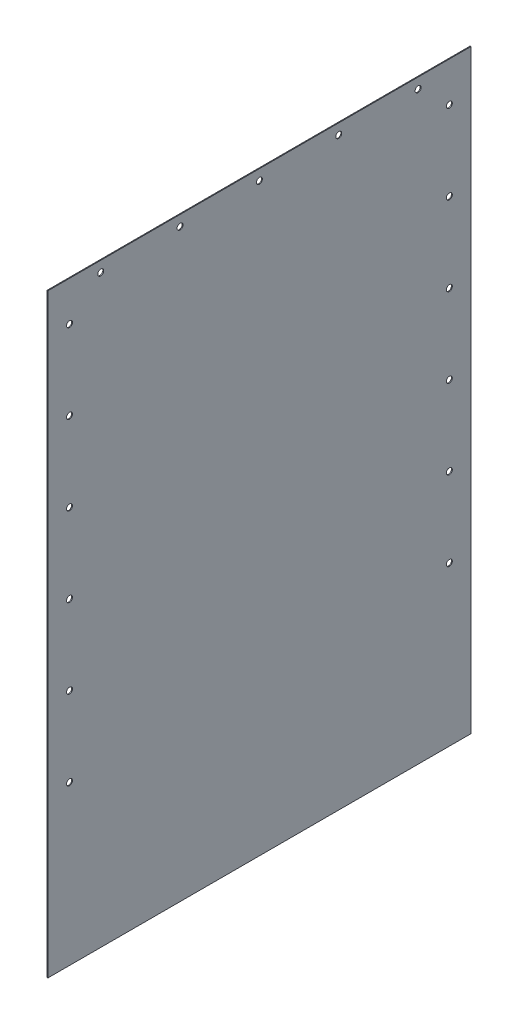
ISO-10303-21;
HEADER;
FILE_DESCRIPTION(('STEP AP214'),'2;1');
FILE_NAME('part.step','',(''),(''),'','','');
FILE_SCHEMA(('AUTOMOTIVE_DESIGN { 1 0 10303 214 1 1 1 1 }'));
ENDSEC;
DATA;
#1=APPLICATION_CONTEXT('core data for automotive mechanical design processes');
#2=APPLICATION_PROTOCOL_DEFINITION('international standard','automotive_design',2000,#1);
#3=PRODUCT_CONTEXT('',#1,'mechanical');
#4=PRODUCT('Part','Part','',(#3));
#5=PRODUCT_RELATED_PRODUCT_CATEGORY('part','',(#4));
#6=PRODUCT_DEFINITION_FORMATION('','',#4);
#7=PRODUCT_DEFINITION_CONTEXT('part definition',#1,'design');
#8=PRODUCT_DEFINITION('design','',#6,#7);
#9=PRODUCT_DEFINITION_SHAPE('','',#8);
#10=(LENGTH_UNIT() NAMED_UNIT(*) SI_UNIT(.MILLI.,.METRE.));
#11=(NAMED_UNIT(*) PLANE_ANGLE_UNIT() SI_UNIT($,.RADIAN.));
#12=(NAMED_UNIT(*) SI_UNIT($,.STERADIAN.) SOLID_ANGLE_UNIT());
#13=UNCERTAINTY_MEASURE_WITH_UNIT(LENGTH_MEASURE(1.E-05),#10,'distance_accuracy_value','');
#14=(GEOMETRIC_REPRESENTATION_CONTEXT(3) GLOBAL_UNCERTAINTY_ASSIGNED_CONTEXT((#13)) GLOBAL_UNIT_ASSIGNED_CONTEXT((#10,
#11,#12)) REPRESENTATION_CONTEXT('',''));
#15=CARTESIAN_POINT('',(0.,0.,0.));
#16=DIRECTION('',(0.,0.,1.));
#17=DIRECTION('',(1.,0.,0.));
#18=AXIS2_PLACEMENT_3D('',#15,#16,#17);
#19=CARTESIAN_POINT('',(0.635,0.,0.));
#20=DIRECTION('',(1.,0.,0.));
#21=DIRECTION('',(0.,0.,-1.));
#22=AXIS2_PLACEMENT_3D('',#19,#20,#21);
#23=PLANE('',#22);
#24=CARTESIAN_POINT('',(0.635,102.706003584229,-78.9247311827957));
#25=DIRECTION('',(-1.,0.,0.));
#26=DIRECTION('',(0.,0.,1.));
#27=AXIS2_PLACEMENT_3D('',#24,#25,#26);
#28=CIRCLE('',#27,2.248);
#29=CARTESIAN_POINT('',(0.635,102.706003584229,-76.6767311827957));
#30=VERTEX_POINT('',#29);
#31=EDGE_CURVE('E440',#30,#30,#28,.T.);
#32=ORIENTED_EDGE('',*,*,#31,.T.);
#33=EDGE_LOOP('',(#32));
#34=FACE_BOUND('',#33,.T.);
#35=CARTESIAN_POINT('',(0.635,102.706003584229,-138.924731182796));
#36=DIRECTION('',(-1.,0.,0.));
#37=DIRECTION('',(0.,0.,1.));
#38=AXIS2_PLACEMENT_3D('',#35,#36,#37);
#39=CIRCLE('',#38,2.248);
#40=CARTESIAN_POINT('',(0.635,102.706003584229,-136.676731182796));
#41=VERTEX_POINT('',#40);
#42=EDGE_CURVE('E429',#41,#41,#39,.T.);
#43=ORIENTED_EDGE('',*,*,#42,.T.);
#44=EDGE_LOOP('',(#43));
#45=FACE_BOUND('',#44,.T.);
#46=CARTESIAN_POINT('',(0.635,-219.318996415771,-162.524731182796));
#47=DIRECTION('',(-1.,0.,0.));
#48=DIRECTION('',(0.,0.,1.));
#49=AXIS2_PLACEMENT_3D('',#46,#47,#48);
#50=CIRCLE('',#49,2.248);
#51=CARTESIAN_POINT('',(0.635,-219.318996415771,-160.276731182796));
#52=VERTEX_POINT('',#51);
#53=EDGE_CURVE('E423',#52,#52,#50,.T.);
#54=ORIENTED_EDGE('',*,*,#53,.T.);
#55=EDGE_LOOP('',(#54));
#56=FACE_BOUND('',#55,.T.);
#57=CARTESIAN_POINT('',(0.635,-159.318996415771,-162.524731182796));
#58=DIRECTION('',(-1.,0.,0.));
#59=DIRECTION('',(0.,0.,1.));
#60=AXIS2_PLACEMENT_3D('',#57,#58,#59);
#61=CIRCLE('',#60,2.248);
#62=CARTESIAN_POINT('',(0.635,-159.318996415771,-160.276731182796));
#63=VERTEX_POINT('',#62);
#64=EDGE_CURVE('E417',#63,#63,#61,.T.);
#65=ORIENTED_EDGE('',*,*,#64,.T.);
#66=EDGE_LOOP('',(#65));
#67=FACE_BOUND('',#66,.T.);
#68=CARTESIAN_POINT('',(0.635,-99.3189964157706,-162.524731182796));
#69=DIRECTION('',(-1.,0.,0.));
#70=DIRECTION('',(0.,0.,1.));
#71=AXIS2_PLACEMENT_3D('',#68,#69,#70);
#72=CIRCLE('',#71,2.248);
#73=CARTESIAN_POINT('',(0.635,-99.3189964157706,-160.276731182796));
#74=VERTEX_POINT('',#73);
#75=EDGE_CURVE('E411',#74,#74,#72,.T.);
#76=ORIENTED_EDGE('',*,*,#75,.T.);
#77=EDGE_LOOP('',(#76));
#78=FACE_BOUND('',#77,.T.);
#79=CARTESIAN_POINT('',(0.635,-39.3189964157706,-162.524731182796));
#80=DIRECTION('',(-1.,0.,0.));
#81=DIRECTION('',(0.,0.,1.));
#82=AXIS2_PLACEMENT_3D('',#79,#80,#81);
#83=CIRCLE('',#82,2.248);
#84=CARTESIAN_POINT('',(0.635,-39.3189964157706,-160.276731182796));
#85=VERTEX_POINT('',#84);
#86=EDGE_CURVE('E405',#85,#85,#83,.T.);
#87=ORIENTED_EDGE('',*,*,#86,.T.);
#88=EDGE_LOOP('',(#87));
#89=FACE_BOUND('',#88,.T.);
#90=CARTESIAN_POINT('',(0.635,20.6810035842294,-162.524731182796));
#91=DIRECTION('',(-1.,0.,0.));
#92=DIRECTION('',(0.,0.,1.));
#93=AXIS2_PLACEMENT_3D('',#90,#91,#92);
#94=CIRCLE('',#93,2.248);
#95=CARTESIAN_POINT('',(0.635,20.6810035842294,-160.276731182796));
#96=VERTEX_POINT('',#95);
#97=EDGE_CURVE('E399',#96,#96,#94,.T.);
#98=ORIENTED_EDGE('',*,*,#97,.T.);
#99=EDGE_LOOP('',(#98));
#100=FACE_BOUND('',#99,.T.);
#101=CARTESIAN_POINT('',(0.635,80.6810035842294,-162.524731182796));
#102=DIRECTION('',(-1.,0.,0.));
#103=DIRECTION('',(0.,0.,1.));
#104=AXIS2_PLACEMENT_3D('',#101,#102,#103);
#105=CIRCLE('',#104,2.248);
#106=CARTESIAN_POINT('',(0.635,80.6810035842294,-160.276731182796));
#107=VERTEX_POINT('',#106);
#108=EDGE_CURVE('E395',#107,#107,#105,.T.);
#109=ORIENTED_EDGE('',*,*,#108,.T.);
#110=EDGE_LOOP('',(#109));
#111=FACE_BOUND('',#110,.T.);
#112=CARTESIAN_POINT('',(0.635,80.6810035842294,124.675268817204));
#113=DIRECTION('',(1.,0.,0.));
#114=DIRECTION('',(0.,0.,-1.));
#115=AXIS2_PLACEMENT_3D('',#112,#113,#114);
#116=CIRCLE('',#115,2.248);
#117=CARTESIAN_POINT('',(0.635,80.6810035842294,122.427268817204));
#118=VERTEX_POINT('',#117);
#119=EDGE_CURVE('E104',#118,#118,#116,.T.);
#120=ORIENTED_EDGE('',*,*,#119,.F.);
#121=EDGE_LOOP('',(#120));
#122=FACE_BOUND('',#121,.T.);
#123=DIRECTION('',(0.,-1.,0.));
#124=VECTOR('',#123,1.);
#125=CARTESIAN_POINT('',(0.635,110.681003584229,141.075268817204));
#126=LINE('',#125,#124);
#127=CARTESIAN_POINT('',(0.635,110.681003584229,141.075268817204));
#128=VERTEX_POINT('',#127);
#129=CARTESIAN_POINT('',(0.635,-339.318996415771,141.075268817204));
#130=VERTEX_POINT('',#129);
#131=EDGE_CURVE('E86',#128,#130,#126,.T.);
#132=ORIENTED_EDGE('',*,*,#131,.T.);
#133=DIRECTION('',(0.,0.,-1.));
#134=VECTOR('',#133,1.);
#135=CARTESIAN_POINT('',(0.635,-339.318996415771,141.075268817204));
#136=LINE('',#135,#134);
#137=CARTESIAN_POINT('',(0.635,-339.318996415771,-178.924731182796));
#138=VERTEX_POINT('',#137);
#139=EDGE_CURVE('E81',#130,#138,#136,.T.);
#140=ORIENTED_EDGE('',*,*,#139,.T.);
#141=DIRECTION('',(0.,1.,0.));
#142=VECTOR('',#141,1.);
#143=CARTESIAN_POINT('',(0.635,110.681003584229,-178.924731182796));
#144=LINE('',#143,#142);
#145=CARTESIAN_POINT('',(0.635,110.681003584229,-178.924731182796));
#146=VERTEX_POINT('',#145);
#147=EDGE_CURVE('E84',#138,#146,#144,.T.);
#148=ORIENTED_EDGE('',*,*,#147,.T.);
#149=DIRECTION('',(0.,0.,1.));
#150=VECTOR('',#149,1.);
#151=CARTESIAN_POINT('',(0.635,110.681003584229,141.075268817204));
#152=LINE('',#151,#150);
#153=EDGE_CURVE('E50',#146,#128,#152,.T.);
#154=ORIENTED_EDGE('',*,*,#153,.T.);
#155=EDGE_LOOP('',(#132,#140,#148,#154));
#156=FACE_BOUND('',#155,.T.);
#157=CARTESIAN_POINT('',(0.635,20.6810035842294,124.675268817204));
#158=DIRECTION('',(1.,0.,0.));
#159=DIRECTION('',(0.,0.,-1.));
#160=AXIS2_PLACEMENT_3D('',#157,#158,#159);
#161=CIRCLE('',#160,2.248);
#162=CARTESIAN_POINT('',(0.635,20.6810035842294,122.427268817204));
#163=VERTEX_POINT('',#162);
#164=EDGE_CURVE('E390',#163,#163,#161,.T.);
#165=ORIENTED_EDGE('',*,*,#164,.F.);
#166=EDGE_LOOP('',(#165));
#167=FACE_BOUND('',#166,.T.);
#168=CARTESIAN_POINT('',(0.635,-39.3189964157706,124.675268817204));
#169=DIRECTION('',(1.,0.,0.));
#170=DIRECTION('',(0.,0.,-1.));
#171=AXIS2_PLACEMENT_3D('',#168,#169,#170);
#172=CIRCLE('',#171,2.248);
#173=CARTESIAN_POINT('',(0.635,-39.3189964157706,122.427268817204));
#174=VERTEX_POINT('',#173);
#175=EDGE_CURVE('E111',#174,#174,#172,.T.);
#176=ORIENTED_EDGE('',*,*,#175,.F.);
#177=EDGE_LOOP('',(#176));
#178=FACE_BOUND('',#177,.T.);
#179=CARTESIAN_POINT('',(0.635,-99.3189964157706,124.675268817204));
#180=DIRECTION('',(1.,0.,0.));
#181=DIRECTION('',(0.,0.,-1.));
#182=AXIS2_PLACEMENT_3D('',#179,#180,#181);
#183=CIRCLE('',#182,2.248);
#184=CARTESIAN_POINT('',(0.635,-99.3189964157706,122.427268817204));
#185=VERTEX_POINT('',#184);
#186=EDGE_CURVE('E117',#185,#185,#183,.T.);
#187=ORIENTED_EDGE('',*,*,#186,.F.);
#188=EDGE_LOOP('',(#187));
#189=FACE_BOUND('',#188,.T.);
#190=CARTESIAN_POINT('',(0.635,-159.318996415771,124.675268817204));
#191=DIRECTION('',(1.,0.,0.));
#192=DIRECTION('',(0.,0.,-1.));
#193=AXIS2_PLACEMENT_3D('',#190,#191,#192);
#194=CIRCLE('',#193,2.248);
#195=CARTESIAN_POINT('',(0.635,-159.318996415771,122.427268817204));
#196=VERTEX_POINT('',#195);
#197=EDGE_CURVE('E123',#196,#196,#194,.T.);
#198=ORIENTED_EDGE('',*,*,#197,.F.);
#199=EDGE_LOOP('',(#198));
#200=FACE_BOUND('',#199,.T.);
#201=CARTESIAN_POINT('',(0.635,-219.318996415771,124.675268817204));
#202=DIRECTION('',(1.,0.,0.));
#203=DIRECTION('',(0.,0.,-1.));
#204=AXIS2_PLACEMENT_3D('',#201,#202,#203);
#205=CIRCLE('',#204,2.248);
#206=CARTESIAN_POINT('',(0.635,-219.318996415771,122.427268817204));
#207=VERTEX_POINT('',#206);
#208=EDGE_CURVE('E129',#207,#207,#205,.T.);
#209=ORIENTED_EDGE('',*,*,#208,.F.);
#210=EDGE_LOOP('',(#209));
#211=FACE_BOUND('',#210,.T.);
#212=CARTESIAN_POINT('',(0.635,102.706003584229,-18.9247311827957));
#213=DIRECTION('',(-1.,0.,0.));
#214=DIRECTION('',(0.,0.,1.));
#215=AXIS2_PLACEMENT_3D('',#212,#213,#214);
#216=CIRCLE('',#215,2.248);
#217=CARTESIAN_POINT('',(0.635,102.706003584229,-16.6767311827957));
#218=VERTEX_POINT('',#217);
#219=EDGE_CURVE('E135',#218,#218,#216,.T.);
#220=ORIENTED_EDGE('',*,*,#219,.T.);
#221=EDGE_LOOP('',(#220));
#222=FACE_BOUND('',#221,.T.);
#223=CARTESIAN_POINT('',(0.635,102.706003584229,41.0752688172043));
#224=DIRECTION('',(-1.,0.,0.));
#225=DIRECTION('',(0.,0.,1.));
#226=AXIS2_PLACEMENT_3D('',#223,#224,#225);
#227=CIRCLE('',#226,2.248);
#228=CARTESIAN_POINT('',(0.635,102.706003584229,43.3232688172043));
#229=VERTEX_POINT('',#228);
#230=EDGE_CURVE('E141',#229,#229,#227,.T.);
#231=ORIENTED_EDGE('',*,*,#230,.T.);
#232=EDGE_LOOP('',(#231));
#233=FACE_BOUND('',#232,.T.);
#234=CARTESIAN_POINT('',(0.635,102.706003584229,101.075268817204));
#235=DIRECTION('',(-1.,0.,0.));
#236=DIRECTION('',(0.,0.,1.));
#237=AXIS2_PLACEMENT_3D('',#234,#235,#236);
#238=CIRCLE('',#237,2.248);
#239=CARTESIAN_POINT('',(0.635,102.706003584229,103.323268817204));
#240=VERTEX_POINT('',#239);
#241=EDGE_CURVE('E42',#240,#240,#238,.T.);
#242=ORIENTED_EDGE('',*,*,#241,.T.);
#243=EDGE_LOOP('',(#242));
#244=FACE_BOUND('',#243,.T.);
#245=ADVANCED_FACE('F33',(#34,#45,#56,#67,#78,#89,#100,#111,#122,#156,#167,#178,#189,#200,#211,
#222,#233,#244),#23,.T.);
#246=CARTESIAN_POINT('',(0.,0.,0.));
#247=DIRECTION('',(1.,0.,0.));
#248=DIRECTION('',(0.,0.,-1.));
#249=AXIS2_PLACEMENT_3D('',#246,#247,#248);
#250=PLANE('',#249);
#251=CARTESIAN_POINT('',(0.,102.706003584229,-78.9247311827957));
#252=DIRECTION('',(-1.,0.,0.));
#253=DIRECTION('',(0.,0.,1.));
#254=AXIS2_PLACEMENT_3D('',#251,#252,#253);
#255=CIRCLE('',#254,2.248);
#256=CARTESIAN_POINT('',(0.,102.706003584229,-76.6767311827957));
#257=VERTEX_POINT('',#256);
#258=EDGE_CURVE('E435',#257,#257,#255,.T.);
#259=ORIENTED_EDGE('',*,*,#258,.F.);
#260=EDGE_LOOP('',(#259));
#261=FACE_BOUND('',#260,.T.);
#262=CARTESIAN_POINT('',(0.,102.706003584229,-138.924731182796));
#263=DIRECTION('',(-1.,0.,0.));
#264=DIRECTION('',(0.,0.,1.));
#265=AXIS2_PLACEMENT_3D('',#262,#263,#264);
#266=CIRCLE('',#265,2.248);
#267=CARTESIAN_POINT('',(0.,102.706003584229,-136.676731182796));
#268=VERTEX_POINT('',#267);
#269=EDGE_CURVE('E432',#268,#268,#266,.T.);
#270=ORIENTED_EDGE('',*,*,#269,.F.);
#271=EDGE_LOOP('',(#270));
#272=FACE_BOUND('',#271,.T.);
#273=CARTESIAN_POINT('',(0.,-219.318996415771,-162.524731182796));
#274=DIRECTION('',(-1.,0.,0.));
#275=DIRECTION('',(0.,0.,1.));
#276=AXIS2_PLACEMENT_3D('',#273,#274,#275);
#277=CIRCLE('',#276,2.248);
#278=CARTESIAN_POINT('',(0.,-219.318996415771,-160.276731182796));
#279=VERTEX_POINT('',#278);
#280=EDGE_CURVE('E426',#279,#279,#277,.T.);
#281=ORIENTED_EDGE('',*,*,#280,.F.);
#282=EDGE_LOOP('',(#281));
#283=FACE_BOUND('',#282,.T.);
#284=CARTESIAN_POINT('',(0.,-159.318996415771,-162.524731182796));
#285=DIRECTION('',(-1.,0.,0.));
#286=DIRECTION('',(0.,0.,1.));
#287=AXIS2_PLACEMENT_3D('',#284,#285,#286);
#288=CIRCLE('',#287,2.248);
#289=CARTESIAN_POINT('',(0.,-159.318996415771,-160.276731182796));
#290=VERTEX_POINT('',#289);
#291=EDGE_CURVE('E420',#290,#290,#288,.T.);
#292=ORIENTED_EDGE('',*,*,#291,.F.);
#293=EDGE_LOOP('',(#292));
#294=FACE_BOUND('',#293,.T.);
#295=CARTESIAN_POINT('',(0.,-99.3189964157706,-162.524731182796));
#296=DIRECTION('',(-1.,0.,0.));
#297=DIRECTION('',(0.,0.,1.));
#298=AXIS2_PLACEMENT_3D('',#295,#296,#297);
#299=CIRCLE('',#298,2.248);
#300=CARTESIAN_POINT('',(0.,-99.3189964157706,-160.276731182796));
#301=VERTEX_POINT('',#300);
#302=EDGE_CURVE('E414',#301,#301,#299,.T.);
#303=ORIENTED_EDGE('',*,*,#302,.F.);
#304=EDGE_LOOP('',(#303));
#305=FACE_BOUND('',#304,.T.);
#306=CARTESIAN_POINT('',(0.,-39.3189964157706,-162.524731182796));
#307=DIRECTION('',(-1.,0.,0.));
#308=DIRECTION('',(0.,0.,1.));
#309=AXIS2_PLACEMENT_3D('',#306,#307,#308);
#310=CIRCLE('',#309,2.248);
#311=CARTESIAN_POINT('',(0.,-39.3189964157706,-160.276731182796));
#312=VERTEX_POINT('',#311);
#313=EDGE_CURVE('E408',#312,#312,#310,.T.);
#314=ORIENTED_EDGE('',*,*,#313,.F.);
#315=EDGE_LOOP('',(#314));
#316=FACE_BOUND('',#315,.T.);
#317=CARTESIAN_POINT('',(0.,20.6810035842294,-162.524731182796));
#318=DIRECTION('',(-1.,0.,0.));
#319=DIRECTION('',(0.,0.,1.));
#320=AXIS2_PLACEMENT_3D('',#317,#318,#319);
#321=CIRCLE('',#320,2.248);
#322=CARTESIAN_POINT('',(0.,20.6810035842294,-160.276731182796));
#323=VERTEX_POINT('',#322);
#324=EDGE_CURVE('E402',#323,#323,#321,.T.);
#325=ORIENTED_EDGE('',*,*,#324,.F.);
#326=EDGE_LOOP('',(#325));
#327=FACE_BOUND('',#326,.T.);
#328=CARTESIAN_POINT('',(0.,80.6810035842294,-162.524731182796));
#329=DIRECTION('',(-1.,0.,0.));
#330=DIRECTION('',(0.,0.,1.));
#331=AXIS2_PLACEMENT_3D('',#328,#329,#330);
#332=CIRCLE('',#331,2.248);
#333=CARTESIAN_POINT('',(0.,80.6810035842294,-160.276731182796));
#334=VERTEX_POINT('',#333);
#335=EDGE_CURVE('E396',#334,#334,#332,.T.);
#336=ORIENTED_EDGE('',*,*,#335,.F.);
#337=EDGE_LOOP('',(#336));
#338=FACE_BOUND('',#337,.T.);
#339=CARTESIAN_POINT('',(0.,80.6810035842294,124.675268817204));
#340=DIRECTION('',(1.,0.,0.));
#341=DIRECTION('',(0.,0.,-1.));
#342=AXIS2_PLACEMENT_3D('',#339,#340,#341);
#343=CIRCLE('',#342,2.248);
#344=CARTESIAN_POINT('',(0.,80.6810035842294,122.427268817204));
#345=VERTEX_POINT('',#344);
#346=EDGE_CURVE('E384',#345,#345,#343,.T.);
#347=ORIENTED_EDGE('',*,*,#346,.T.);
#348=EDGE_LOOP('',(#347));
#349=FACE_BOUND('',#348,.T.);
#350=DIRECTION('',(0.,-1.,0.));
#351=VECTOR('',#350,1.);
#352=CARTESIAN_POINT('',(0.,110.681003584229,141.075268817204));
#353=LINE('',#352,#351);
#354=CARTESIAN_POINT('',(0.,110.681003584229,141.075268817204));
#355=VERTEX_POINT('',#354);
#356=CARTESIAN_POINT('',(0.,-339.318996415771,141.075268817204));
#357=VERTEX_POINT('',#356);
#358=EDGE_CURVE('E101',#355,#357,#353,.T.);
#359=ORIENTED_EDGE('',*,*,#358,.F.);
#360=DIRECTION('',(0.,0.,1.));
#361=VECTOR('',#360,1.);
#362=CARTESIAN_POINT('',(0.,110.681003584229,141.075268817204));
#363=LINE('',#362,#361);
#364=CARTESIAN_POINT('',(0.,110.681003584229,-178.924731182796));
#365=VERTEX_POINT('',#364);
#366=EDGE_CURVE('E73',#365,#355,#363,.T.);
#367=ORIENTED_EDGE('',*,*,#366,.F.);
#368=DIRECTION('',(0.,1.,0.));
#369=VECTOR('',#368,1.);
#370=CARTESIAN_POINT('',(0.,110.681003584229,-178.924731182796));
#371=LINE('',#370,#369);
#372=CARTESIAN_POINT('',(0.,-339.318996415771,-178.924731182796));
#373=VERTEX_POINT('',#372);
#374=EDGE_CURVE('E67',#373,#365,#371,.T.);
#375=ORIENTED_EDGE('',*,*,#374,.F.);
#376=DIRECTION('',(0.,0.,-1.));
#377=VECTOR('',#376,1.);
#378=CARTESIAN_POINT('',(0.,-339.318996415771,141.075268817204));
#379=LINE('',#378,#377);
#380=EDGE_CURVE('E91',#357,#373,#379,.T.);
#381=ORIENTED_EDGE('',*,*,#380,.F.);
#382=EDGE_LOOP('',(#359,#367,#375,#381));
#383=FACE_BOUND('',#382,.T.);
#384=CARTESIAN_POINT('',(0.,20.6810035842294,124.675268817204));
#385=DIRECTION('',(1.,0.,0.));
#386=DIRECTION('',(0.,0.,-1.));
#387=AXIS2_PLACEMENT_3D('',#384,#385,#386);
#388=CIRCLE('',#387,2.248);
#389=CARTESIAN_POINT('',(0.,20.6810035842294,122.427268817204));
#390=VERTEX_POINT('',#389);
#391=EDGE_CURVE('E386',#390,#390,#388,.T.);
#392=ORIENTED_EDGE('',*,*,#391,.T.);
#393=EDGE_LOOP('',(#392));
#394=FACE_BOUND('',#393,.T.);
#395=CARTESIAN_POINT('',(0.,-39.3189964157706,124.675268817204));
#396=DIRECTION('',(1.,0.,0.));
#397=DIRECTION('',(0.,0.,-1.));
#398=AXIS2_PLACEMENT_3D('',#395,#396,#397);
#399=CIRCLE('',#398,2.248);
#400=CARTESIAN_POINT('',(0.,-39.3189964157706,122.427268817204));
#401=VERTEX_POINT('',#400);
#402=EDGE_CURVE('E114',#401,#401,#399,.T.);
#403=ORIENTED_EDGE('',*,*,#402,.T.);
#404=EDGE_LOOP('',(#403));
#405=FACE_BOUND('',#404,.T.);
#406=CARTESIAN_POINT('',(0.,-99.3189964157706,124.675268817204));
#407=DIRECTION('',(1.,0.,0.));
#408=DIRECTION('',(0.,0.,-1.));
#409=AXIS2_PLACEMENT_3D('',#406,#407,#408);
#410=CIRCLE('',#409,2.248);
#411=CARTESIAN_POINT('',(0.,-99.3189964157706,122.427268817204));
#412=VERTEX_POINT('',#411);
#413=EDGE_CURVE('E120',#412,#412,#410,.T.);
#414=ORIENTED_EDGE('',*,*,#413,.T.);
#415=EDGE_LOOP('',(#414));
#416=FACE_BOUND('',#415,.T.);
#417=CARTESIAN_POINT('',(0.,-159.318996415771,124.675268817204));
#418=DIRECTION('',(1.,0.,0.));
#419=DIRECTION('',(0.,0.,-1.));
#420=AXIS2_PLACEMENT_3D('',#417,#418,#419);
#421=CIRCLE('',#420,2.248);
#422=CARTESIAN_POINT('',(0.,-159.318996415771,122.427268817204));
#423=VERTEX_POINT('',#422);
#424=EDGE_CURVE('E126',#423,#423,#421,.T.);
#425=ORIENTED_EDGE('',*,*,#424,.T.);
#426=EDGE_LOOP('',(#425));
#427=FACE_BOUND('',#426,.T.);
#428=CARTESIAN_POINT('',(0.,-219.318996415771,124.675268817204));
#429=DIRECTION('',(1.,0.,0.));
#430=DIRECTION('',(0.,0.,-1.));
#431=AXIS2_PLACEMENT_3D('',#428,#429,#430);
#432=CIRCLE('',#431,2.248);
#433=CARTESIAN_POINT('',(0.,-219.318996415771,122.427268817204));
#434=VERTEX_POINT('',#433);
#435=EDGE_CURVE('E132',#434,#434,#432,.T.);
#436=ORIENTED_EDGE('',*,*,#435,.T.);
#437=EDGE_LOOP('',(#436));
#438=FACE_BOUND('',#437,.T.);
#439=CARTESIAN_POINT('',(0.,102.706003584229,-18.9247311827957));
#440=DIRECTION('',(-1.,0.,0.));
#441=DIRECTION('',(0.,0.,1.));
#442=AXIS2_PLACEMENT_3D('',#439,#440,#441);
#443=CIRCLE('',#442,2.248);
#444=CARTESIAN_POINT('',(0.,102.706003584229,-16.6767311827957));
#445=VERTEX_POINT('',#444);
#446=EDGE_CURVE('E138',#445,#445,#443,.T.);
#447=ORIENTED_EDGE('',*,*,#446,.F.);
#448=EDGE_LOOP('',(#447));
#449=FACE_BOUND('',#448,.T.);
#450=CARTESIAN_POINT('',(0.,102.706003584229,41.0752688172043));
#451=DIRECTION('',(-1.,0.,0.));
#452=DIRECTION('',(0.,0.,1.));
#453=AXIS2_PLACEMENT_3D('',#450,#451,#452);
#454=CIRCLE('',#453,2.248);
#455=CARTESIAN_POINT('',(0.,102.706003584229,43.3232688172043));
#456=VERTEX_POINT('',#455);
#457=EDGE_CURVE('E144',#456,#456,#454,.T.);
#458=ORIENTED_EDGE('',*,*,#457,.F.);
#459=EDGE_LOOP('',(#458));
#460=FACE_BOUND('',#459,.T.);
#461=CARTESIAN_POINT('',(0.,102.706003584229,101.075268817204));
#462=DIRECTION('',(-1.,0.,0.));
#463=DIRECTION('',(0.,0.,1.));
#464=AXIS2_PLACEMENT_3D('',#461,#462,#463);
#465=CIRCLE('',#464,2.248);
#466=CARTESIAN_POINT('',(0.,102.706003584229,103.323268817204));
#467=VERTEX_POINT('',#466);
#468=EDGE_CURVE('E11',#467,#467,#465,.T.);
#469=ORIENTED_EDGE('',*,*,#468,.F.);
#470=EDGE_LOOP('',(#469));
#471=FACE_BOUND('',#470,.T.);
#472=ADVANCED_FACE('F155',(#261,#272,#283,#294,#305,#316,#327,#338,#349,#383,#394,#405,#416,
#427,#438,#449,#460,#471),#250,.F.);
#473=CARTESIAN_POINT('',(0.635,110.681003584229,141.075268817204));
#474=DIRECTION('',(0.,0.,-1.));
#475=DIRECTION('',(0.,1.,0.));
#476=AXIS2_PLACEMENT_3D('',#473,#474,#475);
#477=PLANE('',#476);
#478=ORIENTED_EDGE('',*,*,#358,.T.);
#479=DIRECTION('',(-1.,0.,0.));
#480=VECTOR('',#479,1.);
#481=CARTESIAN_POINT('',(0.635,-339.318996415771,141.075268817204));
#482=LINE('',#481,#480);
#483=EDGE_CURVE('E92',#130,#357,#482,.T.);
#484=ORIENTED_EDGE('',*,*,#483,.F.);
#485=ORIENTED_EDGE('',*,*,#131,.F.);
#486=DIRECTION('',(-1.,0.,0.));
#487=VECTOR('',#486,1.);
#488=CARTESIAN_POINT('',(0.635,110.681003584229,141.075268817204));
#489=LINE('',#488,#487);
#490=EDGE_CURVE('E97',#128,#355,#489,.T.);
#491=ORIENTED_EDGE('',*,*,#490,.T.);
#492=EDGE_LOOP('',(#478,#484,#485,#491));
#493=FACE_BOUND('',#492,.T.);
#494=ADVANCED_FACE('F157',(#493),#477,.F.);
#495=CARTESIAN_POINT('',(0.635,-339.318996415771,141.075268817204));
#496=DIRECTION('',(0.,1.,0.));
#497=DIRECTION('',(0.,0.,1.));
#498=AXIS2_PLACEMENT_3D('',#495,#496,#497);
#499=PLANE('',#498);
#500=ORIENTED_EDGE('',*,*,#380,.T.);
#501=DIRECTION('',(-1.,0.,0.));
#502=VECTOR('',#501,1.);
#503=CARTESIAN_POINT('',(0.635,-339.318996415771,-178.924731182796));
#504=LINE('',#503,#502);
#505=EDGE_CURVE('E89',#138,#373,#504,.T.);
#506=ORIENTED_EDGE('',*,*,#505,.F.);
#507=ORIENTED_EDGE('',*,*,#139,.F.);
#508=ORIENTED_EDGE('',*,*,#483,.T.);
#509=EDGE_LOOP('',(#500,#506,#507,#508));
#510=FACE_BOUND('',#509,.T.);
#511=ADVANCED_FACE('F90',(#510),#499,.F.);
#512=CARTESIAN_POINT('',(0.635,110.681003584229,-178.924731182796));
#513=DIRECTION('',(0.,0.,1.));
#514=DIRECTION('',(0.,-1.,0.));
#515=AXIS2_PLACEMENT_3D('',#512,#513,#514);
#516=PLANE('',#515);
#517=ORIENTED_EDGE('',*,*,#374,.T.);
#518=DIRECTION('',(-1.,0.,0.));
#519=VECTOR('',#518,1.);
#520=CARTESIAN_POINT('',(0.635,110.681003584229,-178.924731182796));
#521=LINE('',#520,#519);
#522=EDGE_CURVE('E93',#146,#365,#521,.T.);
#523=ORIENTED_EDGE('',*,*,#522,.F.);
#524=ORIENTED_EDGE('',*,*,#147,.F.);
#525=ORIENTED_EDGE('',*,*,#505,.T.);
#526=EDGE_LOOP('',(#517,#523,#524,#525));
#527=FACE_BOUND('',#526,.T.);
#528=ADVANCED_FACE('F95',(#527),#516,.F.);
#529=CARTESIAN_POINT('',(0.635,110.681003584229,141.075268817204));
#530=DIRECTION('',(0.,-1.,0.));
#531=DIRECTION('',(0.,0.,-1.));
#532=AXIS2_PLACEMENT_3D('',#529,#530,#531);
#533=PLANE('',#532);
#534=ORIENTED_EDGE('',*,*,#366,.T.);
#535=ORIENTED_EDGE('',*,*,#490,.F.);
#536=ORIENTED_EDGE('',*,*,#153,.F.);
#537=ORIENTED_EDGE('',*,*,#522,.T.);
#538=EDGE_LOOP('',(#534,#535,#536,#537));
#539=FACE_BOUND('',#538,.T.);
#540=ADVANCED_FACE('F172',(#539),#533,.F.);
#541=CARTESIAN_POINT('',(0.635,80.6810035842294,124.675268817204));
#542=DIRECTION('',(-1.,0.,0.));
#543=DIRECTION('',(0.,0.,1.));
#544=AXIS2_PLACEMENT_3D('',#541,#542,#543);
#545=CYLINDRICAL_SURFACE('',#544,2.248);
#546=ORIENTED_EDGE('',*,*,#119,.T.);
#547=EDGE_LOOP('',(#546));
#548=FACE_BOUND('',#547,.T.);
#549=ORIENTED_EDGE('',*,*,#346,.F.);
#550=EDGE_LOOP('',(#549));
#551=FACE_BOUND('',#550,.T.);
#552=ADVANCED_FACE('F175',(#548,#551),#545,.F.);
#553=CARTESIAN_POINT('',(0.635,20.6810035842294,124.675268817204));
#554=DIRECTION('',(-1.,0.,0.));
#555=DIRECTION('',(0.,0.,1.));
#556=AXIS2_PLACEMENT_3D('',#553,#554,#555);
#557=CYLINDRICAL_SURFACE('',#556,2.248);
#558=ORIENTED_EDGE('',*,*,#164,.T.);
#559=EDGE_LOOP('',(#558));
#560=FACE_BOUND('',#559,.T.);
#561=ORIENTED_EDGE('',*,*,#391,.F.);
#562=EDGE_LOOP('',(#561));
#563=FACE_BOUND('',#562,.T.);
#564=ADVANCED_FACE('F184',(#560,#563),#557,.F.);
#565=CARTESIAN_POINT('',(0.635,-39.3189964157706,124.675268817204));
#566=DIRECTION('',(-1.,0.,0.));
#567=DIRECTION('',(0.,0.,1.));
#568=AXIS2_PLACEMENT_3D('',#565,#566,#567);
#569=CYLINDRICAL_SURFACE('',#568,2.248);
#570=ORIENTED_EDGE('',*,*,#175,.T.);
#571=EDGE_LOOP('',(#570));
#572=FACE_BOUND('',#571,.T.);
#573=ORIENTED_EDGE('',*,*,#402,.F.);
#574=EDGE_LOOP('',(#573));
#575=FACE_BOUND('',#574,.T.);
#576=ADVANCED_FACE('F180',(#572,#575),#569,.F.);
#577=CARTESIAN_POINT('',(0.635,-99.3189964157706,124.675268817204));
#578=DIRECTION('',(-1.,0.,0.));
#579=DIRECTION('',(0.,0.,1.));
#580=AXIS2_PLACEMENT_3D('',#577,#578,#579);
#581=CYLINDRICAL_SURFACE('',#580,2.248);
#582=ORIENTED_EDGE('',*,*,#186,.T.);
#583=EDGE_LOOP('',(#582));
#584=FACE_BOUND('',#583,.T.);
#585=ORIENTED_EDGE('',*,*,#413,.F.);
#586=EDGE_LOOP('',(#585));
#587=FACE_BOUND('',#586,.T.);
#588=ADVANCED_FACE('F183',(#584,#587),#581,.F.);
#589=CARTESIAN_POINT('',(0.635,-159.318996415771,124.675268817204));
#590=DIRECTION('',(-1.,0.,0.));
#591=DIRECTION('',(0.,0.,1.));
#592=AXIS2_PLACEMENT_3D('',#589,#590,#591);
#593=CYLINDRICAL_SURFACE('',#592,2.248);
#594=ORIENTED_EDGE('',*,*,#197,.T.);
#595=EDGE_LOOP('',(#594));
#596=FACE_BOUND('',#595,.T.);
#597=ORIENTED_EDGE('',*,*,#424,.F.);
#598=EDGE_LOOP('',(#597));
#599=FACE_BOUND('',#598,.T.);
#600=ADVANCED_FACE('F188',(#596,#599),#593,.F.);
#601=CARTESIAN_POINT('',(0.635,-219.318996415771,124.675268817204));
#602=DIRECTION('',(-1.,0.,0.));
#603=DIRECTION('',(0.,0.,1.));
#604=AXIS2_PLACEMENT_3D('',#601,#602,#603);
#605=CYLINDRICAL_SURFACE('',#604,2.248);
#606=ORIENTED_EDGE('',*,*,#208,.T.);
#607=EDGE_LOOP('',(#606));
#608=FACE_BOUND('',#607,.T.);
#609=ORIENTED_EDGE('',*,*,#435,.F.);
#610=EDGE_LOOP('',(#609));
#611=FACE_BOUND('',#610,.T.);
#612=ADVANCED_FACE('F192',(#608,#611),#605,.F.);
#613=CARTESIAN_POINT('',(0.635,80.6810035842294,-162.524731182796));
#614=DIRECTION('',(-1.,0.,0.));
#615=DIRECTION('',(0.,0.,1.));
#616=AXIS2_PLACEMENT_3D('',#613,#614,#615);
#617=CYLINDRICAL_SURFACE('',#616,2.248);
#618=ORIENTED_EDGE('',*,*,#108,.F.);
#619=EDGE_LOOP('',(#618));
#620=FACE_BOUND('',#619,.T.);
#621=ORIENTED_EDGE('',*,*,#335,.T.);
#622=EDGE_LOOP('',(#621));
#623=FACE_BOUND('',#622,.T.);
#624=ADVANCED_FACE('F196',(#620,#623),#617,.F.);
#625=CARTESIAN_POINT('',(0.635,20.6810035842294,-162.524731182796));
#626=DIRECTION('',(-1.,0.,0.));
#627=DIRECTION('',(0.,0.,1.));
#628=AXIS2_PLACEMENT_3D('',#625,#626,#627);
#629=CYLINDRICAL_SURFACE('',#628,2.248);
#630=ORIENTED_EDGE('',*,*,#97,.F.);
#631=EDGE_LOOP('',(#630));
#632=FACE_BOUND('',#631,.T.);
#633=ORIENTED_EDGE('',*,*,#324,.T.);
#634=EDGE_LOOP('',(#633));
#635=FACE_BOUND('',#634,.T.);
#636=ADVANCED_FACE('F279',(#632,#635),#629,.F.);
#637=CARTESIAN_POINT('',(0.635,-39.3189964157706,-162.524731182796));
#638=DIRECTION('',(-1.,0.,0.));
#639=DIRECTION('',(0.,0.,1.));
#640=AXIS2_PLACEMENT_3D('',#637,#638,#639);
#641=CYLINDRICAL_SURFACE('',#640,2.248);
#642=ORIENTED_EDGE('',*,*,#86,.F.);
#643=EDGE_LOOP('',(#642));
#644=FACE_BOUND('',#643,.T.);
#645=ORIENTED_EDGE('',*,*,#313,.T.);
#646=EDGE_LOOP('',(#645));
#647=FACE_BOUND('',#646,.T.);
#648=ADVANCED_FACE('F270',(#644,#647),#641,.F.);
#649=CARTESIAN_POINT('',(0.635,-99.3189964157706,-162.524731182796));
#650=DIRECTION('',(-1.,0.,0.));
#651=DIRECTION('',(0.,0.,1.));
#652=AXIS2_PLACEMENT_3D('',#649,#650,#651);
#653=CYLINDRICAL_SURFACE('',#652,2.248);
#654=ORIENTED_EDGE('',*,*,#75,.F.);
#655=EDGE_LOOP('',(#654));
#656=FACE_BOUND('',#655,.T.);
#657=ORIENTED_EDGE('',*,*,#302,.T.);
#658=EDGE_LOOP('',(#657));
#659=FACE_BOUND('',#658,.T.);
#660=ADVANCED_FACE('F261',(#656,#659),#653,.F.);
#661=CARTESIAN_POINT('',(0.635,-159.318996415771,-162.524731182796));
#662=DIRECTION('',(-1.,0.,0.));
#663=DIRECTION('',(0.,0.,1.));
#664=AXIS2_PLACEMENT_3D('',#661,#662,#663);
#665=CYLINDRICAL_SURFACE('',#664,2.248);
#666=ORIENTED_EDGE('',*,*,#64,.F.);
#667=EDGE_LOOP('',(#666));
#668=FACE_BOUND('',#667,.T.);
#669=ORIENTED_EDGE('',*,*,#291,.T.);
#670=EDGE_LOOP('',(#669));
#671=FACE_BOUND('',#670,.T.);
#672=ADVANCED_FACE('F252',(#668,#671),#665,.F.);
#673=CARTESIAN_POINT('',(0.635,-219.318996415771,-162.524731182796));
#674=DIRECTION('',(-1.,0.,0.));
#675=DIRECTION('',(0.,0.,1.));
#676=AXIS2_PLACEMENT_3D('',#673,#674,#675);
#677=CYLINDRICAL_SURFACE('',#676,2.248);
#678=ORIENTED_EDGE('',*,*,#53,.F.);
#679=EDGE_LOOP('',(#678));
#680=FACE_BOUND('',#679,.T.);
#681=ORIENTED_EDGE('',*,*,#280,.T.);
#682=EDGE_LOOP('',(#681));
#683=FACE_BOUND('',#682,.T.);
#684=ADVANCED_FACE('F242',(#680,#683),#677,.F.);
#685=CARTESIAN_POINT('',(0.635,102.706003584229,-138.924731182796));
#686=DIRECTION('',(-1.,0.,0.));
#687=DIRECTION('',(0.,0.,1.));
#688=AXIS2_PLACEMENT_3D('',#685,#686,#687);
#689=CYLINDRICAL_SURFACE('',#688,2.248);
#690=ORIENTED_EDGE('',*,*,#42,.F.);
#691=EDGE_LOOP('',(#690));
#692=FACE_BOUND('',#691,.T.);
#693=ORIENTED_EDGE('',*,*,#269,.T.);
#694=EDGE_LOOP('',(#693));
#695=FACE_BOUND('',#694,.T.);
#696=ADVANCED_FACE('F233',(#692,#695),#689,.F.);
#697=CARTESIAN_POINT('',(0.635,102.706003584229,-78.9247311827957));
#698=DIRECTION('',(-1.,0.,0.));
#699=DIRECTION('',(0.,0.,1.));
#700=AXIS2_PLACEMENT_3D('',#697,#698,#699);
#701=CYLINDRICAL_SURFACE('',#700,2.248);
#702=ORIENTED_EDGE('',*,*,#31,.F.);
#703=EDGE_LOOP('',(#702));
#704=FACE_BOUND('',#703,.T.);
#705=ORIENTED_EDGE('',*,*,#258,.T.);
#706=EDGE_LOOP('',(#705));
#707=FACE_BOUND('',#706,.T.);
#708=ADVANCED_FACE('F200',(#704,#707),#701,.F.);
#709=CARTESIAN_POINT('',(0.635,102.706003584229,-18.9247311827957));
#710=DIRECTION('',(-1.,0.,0.));
#711=DIRECTION('',(0.,0.,1.));
#712=AXIS2_PLACEMENT_3D('',#709,#710,#711);
#713=CYLINDRICAL_SURFACE('',#712,2.248);
#714=ORIENTED_EDGE('',*,*,#219,.F.);
#715=EDGE_LOOP('',(#714));
#716=FACE_BOUND('',#715,.T.);
#717=ORIENTED_EDGE('',*,*,#446,.T.);
#718=EDGE_LOOP('',(#717));
#719=FACE_BOUND('',#718,.T.);
#720=ADVANCED_FACE('F198',(#716,#719),#713,.F.);
#721=CARTESIAN_POINT('',(0.635,102.706003584229,41.0752688172043));
#722=DIRECTION('',(-1.,0.,0.));
#723=DIRECTION('',(0.,0.,1.));
#724=AXIS2_PLACEMENT_3D('',#721,#722,#723);
#725=CYLINDRICAL_SURFACE('',#724,2.248);
#726=ORIENTED_EDGE('',*,*,#230,.F.);
#727=EDGE_LOOP('',(#726));
#728=FACE_BOUND('',#727,.T.);
#729=ORIENTED_EDGE('',*,*,#457,.T.);
#730=EDGE_LOOP('',(#729));
#731=FACE_BOUND('',#730,.T.);
#732=ADVANCED_FACE('F152',(#728,#731),#725,.F.);
#733=CARTESIAN_POINT('',(0.635,102.706003584229,101.075268817204));
#734=DIRECTION('',(-1.,0.,0.));
#735=DIRECTION('',(0.,0.,1.));
#736=AXIS2_PLACEMENT_3D('',#733,#734,#735);
#737=CYLINDRICAL_SURFACE('',#736,2.248);
#738=ORIENTED_EDGE('',*,*,#241,.F.);
#739=EDGE_LOOP('',(#738));
#740=FACE_BOUND('',#739,.T.);
#741=ORIENTED_EDGE('',*,*,#468,.T.);
#742=EDGE_LOOP('',(#741));
#743=FACE_BOUND('',#742,.T.);
#744=ADVANCED_FACE('F35',(#740,#743),#737,.F.);
#745=CLOSED_SHELL('',(#245,#472,#494,#511,#528,#540,#552,#564,#576,#588,#600,#612,#624,#636,
#648,#660,#672,#684,#696,#708,#720,#732,#744));
#746=MANIFOLD_SOLID_BREP('B2',#745);
#747=ADVANCED_BREP_SHAPE_REPRESENTATION('',(#18,#746),#14);
#748=SHAPE_DEFINITION_REPRESENTATION(#9,#747);
ENDSEC;
END-ISO-10303-21;
